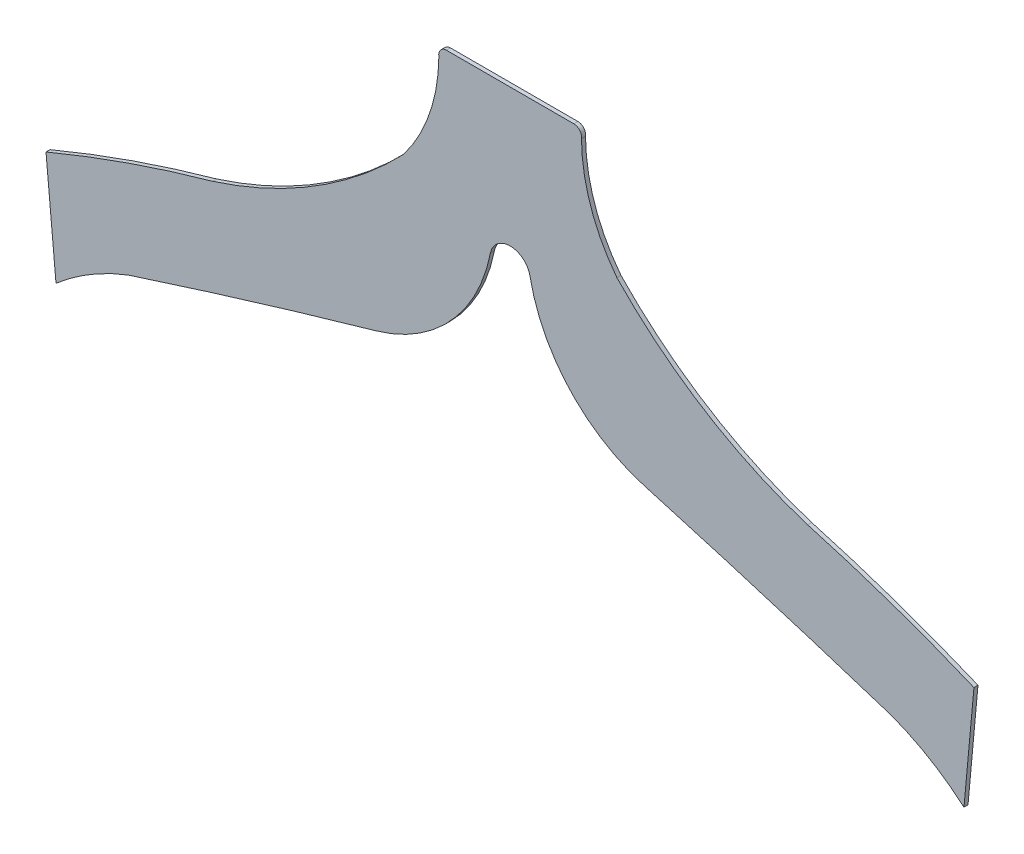
ISO-10303-21;
HEADER;
FILE_DESCRIPTION(('STEP AP214'),'2;1');
FILE_NAME('part.step','',(''),(''),'','','');
FILE_SCHEMA(('AUTOMOTIVE_DESIGN { 1 0 10303 214 1 1 1 1 }'));
ENDSEC;
DATA;
#1=APPLICATION_CONTEXT('core data for automotive mechanical design processes');
#2=APPLICATION_PROTOCOL_DEFINITION('international standard','automotive_design',2000,#1);
#3=PRODUCT_CONTEXT('',#1,'mechanical');
#4=PRODUCT('Part','Part','',(#3));
#5=PRODUCT_RELATED_PRODUCT_CATEGORY('part','',(#4));
#6=PRODUCT_DEFINITION_FORMATION('','',#4);
#7=PRODUCT_DEFINITION_CONTEXT('part definition',#1,'design');
#8=PRODUCT_DEFINITION('design','',#6,#7);
#9=PRODUCT_DEFINITION_SHAPE('','',#8);
#10=(LENGTH_UNIT() NAMED_UNIT(*) SI_UNIT(.MILLI.,.METRE.));
#11=(NAMED_UNIT(*) PLANE_ANGLE_UNIT() SI_UNIT($,.RADIAN.));
#12=(NAMED_UNIT(*) SI_UNIT($,.STERADIAN.) SOLID_ANGLE_UNIT());
#13=UNCERTAINTY_MEASURE_WITH_UNIT(LENGTH_MEASURE(1.E-05),#10,'distance_accuracy_value','');
#14=(GEOMETRIC_REPRESENTATION_CONTEXT(3) GLOBAL_UNCERTAINTY_ASSIGNED_CONTEXT((#13)) GLOBAL_UNIT_ASSIGNED_CONTEXT((#10,
#11,#12)) REPRESENTATION_CONTEXT('',''));
#15=CARTESIAN_POINT('',(0.,0.,0.));
#16=DIRECTION('',(0.,0.,1.));
#17=DIRECTION('',(1.,0.,0.));
#18=AXIS2_PLACEMENT_3D('',#15,#16,#17);
#19=CARTESIAN_POINT('',(-739.962312354849,864.313923100061,0.));
#20=DIRECTION('',(-0.995795754844476,-0.0916013899115097,0.));
#21=DIRECTION('',(0.0916013899115097,-0.995795754844476,0.));
#22=AXIS2_PLACEMENT_3D('',#19,#20,#21);
#23=PLANE('',#22);
#24=DIRECTION('',(0.0916013899115097,-0.995795754844476,0.));
#25=VECTOR('',#24,1.);
#26=CARTESIAN_POINT('',(-456.655661603026,-2215.50353829879,6.35));
#27=LINE('',#26,#25);
#28=CARTESIAN_POINT('',(-728.998263502241,745.124101702356,6.35));
#29=VERTEX_POINT('',#28);
#30=CARTESIAN_POINT('',(-713.283018643652,574.284181788008,6.35));
#31=VERTEX_POINT('',#30);
#32=EDGE_CURVE('E180',#29,#31,#27,.T.);
#33=ORIENTED_EDGE('',*,*,#32,.F.);
#34=DIRECTION('',(0.,0.,-1.));
#35=VECTOR('',#34,1.);
#36=CARTESIAN_POINT('',(-728.998263502241,745.124101702356,6.35));
#37=LINE('',#36,#35);
#38=CARTESIAN_POINT('',(-728.998263502241,745.124101702356,0.));
#39=VERTEX_POINT('',#38);
#40=EDGE_CURVE('E40',#29,#39,#37,.T.);
#41=ORIENTED_EDGE('',*,*,#40,.T.);
#42=DIRECTION('',(0.0916013899115097,-0.995795754844476,0.));
#43=VECTOR('',#42,1.);
#44=CARTESIAN_POINT('',(-456.655661603026,-2215.50353829879,0.));
#45=LINE('',#44,#43);
#46=CARTESIAN_POINT('',(-713.283018643652,574.284181788008,0.));
#47=VERTEX_POINT('',#46);
#48=EDGE_CURVE('E45',#39,#47,#45,.T.);
#49=ORIENTED_EDGE('',*,*,#48,.T.);
#50=DIRECTION('',(0.,0.,-1.));
#51=VECTOR('',#50,1.);
#52=CARTESIAN_POINT('',(-713.283018643652,574.284181788008,6.35));
#53=LINE('',#52,#51);
#54=EDGE_CURVE('E300',#31,#47,#53,.T.);
#55=ORIENTED_EDGE('',*,*,#54,.F.);
#56=EDGE_LOOP('',(#33,#41,#49,#55));
#57=FACE_BOUND('',#56,.T.);
#58=ADVANCED_FACE('F36',(#57),#23,.T.);
#59=CARTESIAN_POINT('',(739.962312354849,864.313923100061,0.));
#60=DIRECTION('',(0.995795754844476,-0.0916013899115097,0.));
#61=DIRECTION('',(-0.0916013899115097,-0.995795754844476,0.));
#62=AXIS2_PLACEMENT_3D('',#59,#60,#61);
#63=PLANE('',#62);
#64=DIRECTION('',(0.0916013899115097,0.995795754844476,0.));
#65=VECTOR('',#64,1.);
#66=CARTESIAN_POINT('',(453.174620911436,-2253.34581936543,0.));
#67=LINE('',#66,#65);
#68=CARTESIAN_POINT('',(713.326960600996,574.761873388814,0.));
#69=VERTEX_POINT('',#68);
#70=CARTESIAN_POINT('',(729.020382278945,745.364554210394,0.));
#71=VERTEX_POINT('',#70);
#72=EDGE_CURVE('E11',#69,#71,#67,.T.);
#73=ORIENTED_EDGE('',*,*,#72,.T.);
#74=DIRECTION('',(0.,0.,-1.));
#75=VECTOR('',#74,1.);
#76=CARTESIAN_POINT('',(729.020382278945,745.364554210394,6.35));
#77=LINE('',#76,#75);
#78=CARTESIAN_POINT('',(729.020382278945,745.364554210394,6.35));
#79=VERTEX_POINT('',#78);
#80=EDGE_CURVE('E301',#71,#79,#77,.F.);
#81=ORIENTED_EDGE('',*,*,#80,.T.);
#82=DIRECTION('',(0.0916013899115097,0.995795754844476,0.));
#83=VECTOR('',#82,1.);
#84=CARTESIAN_POINT('',(453.174620911436,-2253.34581936543,6.35));
#85=LINE('',#84,#83);
#86=CARTESIAN_POINT('',(713.326960600996,574.761873388814,6.35));
#87=VERTEX_POINT('',#86);
#88=EDGE_CURVE('E283',#87,#79,#85,.T.);
#89=ORIENTED_EDGE('',*,*,#88,.F.);
#90=DIRECTION('',(0.,0.,-1.));
#91=VECTOR('',#90,1.);
#92=CARTESIAN_POINT('',(713.326960600996,574.761873388813,6.35));
#93=LINE('',#92,#91);
#94=EDGE_CURVE('E298',#69,#87,#93,.F.);
#95=ORIENTED_EDGE('',*,*,#94,.F.);
#96=EDGE_LOOP('',(#73,#81,#89,#95));
#97=FACE_BOUND('',#96,.T.);
#98=ADVANCED_FACE('F38',(#97),#63,.T.);
#99=CARTESIAN_POINT('',(-464.236109922188,286.805130748695,6.35));
#100=DIRECTION('',(0.,0.,-1.));
#101=DIRECTION('',(-1.,0.,0.));
#102=AXIS2_PLACEMENT_3D('',#99,#100,#101);
#103=CYLINDRICAL_SURFACE('',#102,380.353214170961);
#104=CARTESIAN_POINT('',(-464.236109922188,286.805130748695,6.35));
#105=DIRECTION('',(0.,0.,1.));
#106=DIRECTION('',(1.,0.,0.));
#107=AXIS2_PLACEMENT_3D('',#104,#105,#106);
#108=CIRCLE('',#107,380.353214170961);
#109=CARTESIAN_POINT('',(-598.936998152931,642.507588204403,6.35));
#110=VERTEX_POINT('',#109);
#111=EDGE_CURVE('E168',#110,#31,#108,.T.);
#112=ORIENTED_EDGE('',*,*,#111,.T.);
#113=ORIENTED_EDGE('',*,*,#54,.T.);
#114=CARTESIAN_POINT('',(-464.236109922188,286.805130748695,0.));
#115=DIRECTION('',(0.,0.,1.));
#116=DIRECTION('',(1.,0.,0.));
#117=AXIS2_PLACEMENT_3D('',#114,#115,#116);
#118=CIRCLE('',#117,380.353214170961);
#119=CARTESIAN_POINT('',(-598.936998152931,642.507588204403,0.));
#120=VERTEX_POINT('',#119);
#121=EDGE_CURVE('E61',#120,#47,#118,.T.);
#122=ORIENTED_EDGE('',*,*,#121,.F.);
#123=DIRECTION('',(0.,0.,-1.));
#124=VECTOR('',#123,1.);
#125=CARTESIAN_POINT('',(-598.936998152931,642.507588204403,6.35));
#126=LINE('',#125,#124);
#127=EDGE_CURVE('E165',#110,#120,#126,.T.);
#128=ORIENTED_EDGE('',*,*,#127,.F.);
#129=EDGE_LOOP('',(#112,#113,#122,#128));
#130=FACE_BOUND('',#129,.T.);
#131=ADVANCED_FACE('F167',(#130),#103,.F.);
#132=CARTESIAN_POINT('',(2910.47635786436,-10166.0613568427,6.35));
#133=DIRECTION('',(0.,0.,-1.));
#134=DIRECTION('',(-1.,0.,0.));
#135=AXIS2_PLACEMENT_3D('',#132,#133,#134);
#136=CYLINDRICAL_SURFACE('',#135,11364.0285437528);
#137=CARTESIAN_POINT('',(2910.47635786436,-10166.0613568427,0.));
#138=DIRECTION('',(0.,0.,1.));
#139=DIRECTION('',(1.,0.,0.));
#140=AXIS2_PLACEMENT_3D('',#137,#138,#139);
#141=CIRCLE('',#140,11364.0285437528);
#142=CARTESIAN_POINT('',(-210.317049563548,761.051402316683,0.));
#143=VERTEX_POINT('',#142);
#144=EDGE_CURVE('E226',#143,#120,#141,.T.);
#145=ORIENTED_EDGE('',*,*,#144,.F.);
#146=DIRECTION('',(0.,0.,-1.));
#147=VECTOR('',#146,1.);
#148=CARTESIAN_POINT('',(-210.317049563548,761.051402316683,6.35));
#149=LINE('',#148,#147);
#150=CARTESIAN_POINT('',(-210.317049563548,761.051402316683,6.35));
#151=VERTEX_POINT('',#150);
#152=EDGE_CURVE('E173',#151,#143,#149,.T.);
#153=ORIENTED_EDGE('',*,*,#152,.F.);
#154=CARTESIAN_POINT('',(2910.47635786436,-10166.0613568427,6.35));
#155=DIRECTION('',(0.,0.,1.));
#156=DIRECTION('',(1.,0.,0.));
#157=AXIS2_PLACEMENT_3D('',#154,#155,#156);
#158=CIRCLE('',#157,11364.0285437528);
#159=EDGE_CURVE('E179',#151,#110,#158,.T.);
#160=ORIENTED_EDGE('',*,*,#159,.T.);
#161=ORIENTED_EDGE('',*,*,#127,.T.);
#162=EDGE_LOOP('',(#145,#153,#160,#161));
#163=FACE_BOUND('',#162,.T.);
#164=ADVANCED_FACE('F184',(#163),#136,.F.);
#165=CARTESIAN_POINT('',(-280.070616472063,1005.28579773129,6.35));
#166=DIRECTION('',(0.,0.,-1.));
#167=DIRECTION('',(-1.,0.,0.));
#168=AXIS2_PLACEMENT_3D('',#165,#166,#167);
#169=CYLINDRICAL_SURFACE('',#168,254.000000000009);
#170=CARTESIAN_POINT('',(-280.070616472063,1005.28579773129,0.));
#171=DIRECTION('',(0.,0.,1.));
#172=DIRECTION('',(1.,0.,0.));
#173=AXIS2_PLACEMENT_3D('',#170,#171,#172);
#174=CIRCLE('',#173,254.000000000009);
#175=CARTESIAN_POINT('',(-30.8538816694499,956.22441684638,0.));
#176=VERTEX_POINT('',#175);
#177=EDGE_CURVE('E228',#143,#176,#174,.T.);
#178=ORIENTED_EDGE('',*,*,#177,.T.);
#179=DIRECTION('',(0.,0.,-1.));
#180=VECTOR('',#179,1.);
#181=CARTESIAN_POINT('',(-30.8538816694499,956.22441684638,6.35));
#182=LINE('',#181,#180);
#183=CARTESIAN_POINT('',(-30.8538816694499,956.22441684638,6.35));
#184=VERTEX_POINT('',#183);
#185=EDGE_CURVE('E289',#184,#176,#182,.T.);
#186=ORIENTED_EDGE('',*,*,#185,.F.);
#187=CARTESIAN_POINT('',(-280.070616472063,1005.28579773129,6.35));
#188=DIRECTION('',(0.,0.,1.));
#189=DIRECTION('',(1.,0.,0.));
#190=AXIS2_PLACEMENT_3D('',#187,#188,#189);
#191=CIRCLE('',#190,254.000000000009);
#192=EDGE_CURVE('E186',#151,#184,#191,.T.);
#193=ORIENTED_EDGE('',*,*,#192,.F.);
#194=ORIENTED_EDGE('',*,*,#152,.T.);
#195=EDGE_LOOP('',(#178,#186,#193,#194));
#196=FACE_BOUND('',#195,.T.);
#197=ADVANCED_FACE('F362',(#196),#169,.T.);
#198=CARTESIAN_POINT('',(0.298210181109315,950.091744235703,6.35));
#199=DIRECTION('',(0.,0.,-1.));
#200=DIRECTION('',(-1.,0.,0.));
#201=AXIS2_PLACEMENT_3D('',#198,#199,#200);
#202=CYLINDRICAL_SURFACE('',#201,31.7500000002431);
#203=CARTESIAN_POINT('',(0.298210181109315,950.091744235703,0.));
#204=DIRECTION('',(0.,0.,1.));
#205=DIRECTION('',(1.,0.,0.));
#206=AXIS2_PLACEMENT_3D('',#203,#204,#205);
#207=CIRCLE('',#206,31.7500000002431);
#208=CARTESIAN_POINT('',(31.4503020317647,956.224416846365,0.));
#209=VERTEX_POINT('',#208);
#210=EDGE_CURVE('E231',#209,#176,#207,.T.);
#211=ORIENTED_EDGE('',*,*,#210,.F.);
#212=DIRECTION('',(0.,0.,-1.));
#213=VECTOR('',#212,1.);
#214=CARTESIAN_POINT('',(31.4503020317647,956.224416846365,6.35));
#215=LINE('',#214,#213);
#216=CARTESIAN_POINT('',(31.4503020317647,956.224416846365,6.35));
#217=VERTEX_POINT('',#216);
#218=EDGE_CURVE('E287',#217,#209,#215,.T.);
#219=ORIENTED_EDGE('',*,*,#218,.F.);
#220=CARTESIAN_POINT('',(0.298210181109315,950.091744235703,6.35));
#221=DIRECTION('',(0.,0.,1.));
#222=DIRECTION('',(1.,0.,0.));
#223=AXIS2_PLACEMENT_3D('',#220,#221,#222);
#224=CIRCLE('',#223,31.7500000002431);
#225=EDGE_CURVE('E188',#217,#184,#224,.T.);
#226=ORIENTED_EDGE('',*,*,#225,.T.);
#227=ORIENTED_EDGE('',*,*,#185,.T.);
#228=EDGE_LOOP('',(#211,#219,#226,#227));
#229=FACE_BOUND('',#228,.T.);
#230=ADVANCED_FACE('F359',(#229),#202,.F.);
#231=CARTESIAN_POINT('',(280.667036834467,1005.28579773129,6.35));
#232=DIRECTION('',(0.,0.,-1.));
#233=DIRECTION('',(-1.,0.,0.));
#234=AXIS2_PLACEMENT_3D('',#231,#232,#233);
#235=CYLINDRICAL_SURFACE('',#234,254.000000000009);
#236=CARTESIAN_POINT('',(280.667036834467,1005.28579773129,0.));
#237=DIRECTION('',(0.,0.,1.));
#238=DIRECTION('',(1.,0.,0.));
#239=AXIS2_PLACEMENT_3D('',#236,#237,#238);
#240=CIRCLE('',#239,254.000000000009);
#241=CARTESIAN_POINT('',(210.913469904233,761.051402322885,0.));
#242=VERTEX_POINT('',#241);
#243=EDGE_CURVE('E234',#209,#242,#240,.T.);
#244=ORIENTED_EDGE('',*,*,#243,.T.);
#245=DIRECTION('',(0.,0.,-1.));
#246=VECTOR('',#245,1.);
#247=CARTESIAN_POINT('',(210.913469904233,761.051402322885,6.35));
#248=LINE('',#247,#246);
#249=CARTESIAN_POINT('',(210.913469904233,761.051402322885,6.35));
#250=VERTEX_POINT('',#249);
#251=EDGE_CURVE('E285',#250,#242,#248,.T.);
#252=ORIENTED_EDGE('',*,*,#251,.F.);
#253=CARTESIAN_POINT('',(280.667036834467,1005.28579773129,6.35));
#254=DIRECTION('',(0.,0.,1.));
#255=DIRECTION('',(1.,0.,0.));
#256=AXIS2_PLACEMENT_3D('',#253,#254,#255);
#257=CIRCLE('',#256,254.000000000009);
#258=EDGE_CURVE('E193',#217,#250,#257,.T.);
#259=ORIENTED_EDGE('',*,*,#258,.F.);
#260=ORIENTED_EDGE('',*,*,#218,.T.);
#261=EDGE_LOOP('',(#244,#252,#259,#260));
#262=FACE_BOUND('',#261,.T.);
#263=ADVANCED_FACE('F371',(#262),#235,.T.);
#264=CARTESIAN_POINT('',(-2909.87993750195,-10166.0613568427,6.35));
#265=DIRECTION('',(0.,0.,-1.));
#266=DIRECTION('',(-1.,0.,0.));
#267=AXIS2_PLACEMENT_3D('',#264,#265,#266);
#268=CYLINDRICAL_SURFACE('',#267,11364.0285437528);
#269=CARTESIAN_POINT('',(-2909.87993750195,-10166.0613568427,0.));
#270=DIRECTION('',(0.,0.,1.));
#271=DIRECTION('',(1.,0.,0.));
#272=AXIS2_PLACEMENT_3D('',#269,#270,#271);
#273=CIRCLE('',#272,11364.0285437528);
#274=CARTESIAN_POINT('',(599.533418515338,642.507588204403,0.));
#275=VERTEX_POINT('',#274);
#276=EDGE_CURVE('E237',#275,#242,#273,.T.);
#277=ORIENTED_EDGE('',*,*,#276,.F.);
#278=DIRECTION('',(0.,0.,-1.));
#279=VECTOR('',#278,1.);
#280=CARTESIAN_POINT('',(599.533418515338,642.507588204403,6.35));
#281=LINE('',#280,#279);
#282=CARTESIAN_POINT('',(599.533418515338,642.507588204403,6.35));
#283=VERTEX_POINT('',#282);
#284=EDGE_CURVE('E224',#283,#275,#281,.T.);
#285=ORIENTED_EDGE('',*,*,#284,.F.);
#286=CARTESIAN_POINT('',(-2909.87993750195,-10166.0613568427,6.35));
#287=DIRECTION('',(0.,0.,1.));
#288=DIRECTION('',(1.,0.,0.));
#289=AXIS2_PLACEMENT_3D('',#286,#287,#288);
#290=CIRCLE('',#289,11364.0285437528);
#291=EDGE_CURVE('E195',#283,#250,#290,.T.);
#292=ORIENTED_EDGE('',*,*,#291,.T.);
#293=ORIENTED_EDGE('',*,*,#251,.T.);
#294=EDGE_LOOP('',(#277,#285,#292,#293));
#295=FACE_BOUND('',#294,.T.);
#296=ADVANCED_FACE('F353',(#295),#268,.F.);
#297=CARTESIAN_POINT('',(464.83253028459,286.805130748693,6.35));
#298=DIRECTION('',(0.,0.,-1.));
#299=DIRECTION('',(-1.,0.,0.));
#300=AXIS2_PLACEMENT_3D('',#297,#298,#299);
#301=CYLINDRICAL_SURFACE('',#300,380.353214170964);
#302=CARTESIAN_POINT('',(464.83253028459,286.805130748693,0.));
#303=DIRECTION('',(0.,0.,1.));
#304=DIRECTION('',(1.,0.,0.));
#305=AXIS2_PLACEMENT_3D('',#302,#303,#304);
#306=CIRCLE('',#305,380.353214170964);
#307=EDGE_CURVE('E53',#69,#275,#306,.T.);
#308=ORIENTED_EDGE('',*,*,#307,.F.);
#309=ORIENTED_EDGE('',*,*,#94,.T.);
#310=CARTESIAN_POINT('',(464.83253028459,286.805130748693,6.35));
#311=DIRECTION('',(0.,0.,1.));
#312=DIRECTION('',(1.,0.,0.));
#313=AXIS2_PLACEMENT_3D('',#310,#311,#312);
#314=CIRCLE('',#313,380.353214170964);
#315=EDGE_CURVE('E198',#87,#283,#314,.T.);
#316=ORIENTED_EDGE('',*,*,#315,.T.);
#317=ORIENTED_EDGE('',*,*,#284,.T.);
#318=EDGE_LOOP('',(#308,#309,#316,#317));
#319=FACE_BOUND('',#318,.T.);
#320=ADVANCED_FACE('F345',(#319),#301,.F.);
#321=CARTESIAN_POINT('',(-132.728995937928,-1313.66098101385,6.35));
#322=DIRECTION('',(0.,0.,-1.));
#323=DIRECTION('',(-1.,0.,0.));
#324=AXIS2_PLACEMENT_3D('',#321,#322,#323);
#325=CYLINDRICAL_SURFACE('',#324,2232.08381239653);
#326=ORIENTED_EDGE('',*,*,#80,.F.);
#327=CARTESIAN_POINT('',(-132.728995937928,-1313.66098101385,0.));
#328=DIRECTION('',(0.,0.,1.));
#329=DIRECTION('',(1.,0.,0.));
#330=AXIS2_PLACEMENT_3D('',#327,#328,#329);
#331=CIRCLE('',#330,2232.08381239653);
#332=CARTESIAN_POINT('',(467.685955529307,836.152971777706,0.));
#333=VERTEX_POINT('',#332);
#334=EDGE_CURVE('E241',#71,#333,#331,.T.);
#335=ORIENTED_EDGE('',*,*,#334,.T.);
#336=DIRECTION('',(0.,0.,-1.));
#337=VECTOR('',#336,1.);
#338=CARTESIAN_POINT('',(467.685955529307,836.152971777706,6.35));
#339=LINE('',#338,#337);
#340=CARTESIAN_POINT('',(467.685955529307,836.152971777706,6.35));
#341=VERTEX_POINT('',#340);
#342=EDGE_CURVE('E280',#341,#333,#339,.T.);
#343=ORIENTED_EDGE('',*,*,#342,.F.);
#344=CARTESIAN_POINT('',(-132.728995937928,-1313.66098101385,6.35));
#345=DIRECTION('',(0.,0.,1.));
#346=DIRECTION('',(1.,0.,0.));
#347=AXIS2_PLACEMENT_3D('',#344,#345,#346);
#348=CIRCLE('',#347,2232.08381239653);
#349=EDGE_CURVE('E200',#79,#341,#348,.T.);
#350=ORIENTED_EDGE('',*,*,#349,.F.);
#351=EDGE_LOOP('',(#326,#335,#343,#350));
#352=FACE_BOUND('',#351,.T.);
#353=ADVANCED_FACE('F342',(#352),#325,.T.);
#354=CARTESIAN_POINT('',(683.789534639859,1517.62665916351,6.35));
#355=DIRECTION('',(0.,0.,-1.));
#356=DIRECTION('',(-1.,0.,0.));
#357=AXIS2_PLACEMENT_3D('',#354,#355,#356);
#358=CYLINDRICAL_SURFACE('',#357,714.917578119043);
#359=CARTESIAN_POINT('',(683.789534639859,1517.62665916351,0.));
#360=DIRECTION('',(0.,0.,1.));
#361=DIRECTION('',(1.,0.,0.));
#362=AXIS2_PLACEMENT_3D('',#359,#360,#361);
#363=CIRCLE('',#362,714.917578119043);
#364=CARTESIAN_POINT('',(168.209342452343,1022.36490117337,0.));
#365=VERTEX_POINT('',#364);
#366=EDGE_CURVE('E243',#365,#333,#363,.T.);
#367=ORIENTED_EDGE('',*,*,#366,.F.);
#368=DIRECTION('',(0.,0.,-1.));
#369=VECTOR('',#368,1.);
#370=CARTESIAN_POINT('',(168.209342452343,1022.36490117337,6.35));
#371=LINE('',#370,#369);
#372=CARTESIAN_POINT('',(168.209342452343,1022.36490117337,6.35));
#373=VERTEX_POINT('',#372);
#374=EDGE_CURVE('E278',#373,#365,#371,.T.);
#375=ORIENTED_EDGE('',*,*,#374,.F.);
#376=CARTESIAN_POINT('',(683.789534639859,1517.62665916351,6.35));
#377=DIRECTION('',(0.,0.,1.));
#378=DIRECTION('',(1.,0.,0.));
#379=AXIS2_PLACEMENT_3D('',#376,#377,#378);
#380=CIRCLE('',#379,714.917578119043);
#381=EDGE_CURVE('E202',#373,#341,#380,.T.);
#382=ORIENTED_EDGE('',*,*,#381,.T.);
#383=ORIENTED_EDGE('',*,*,#342,.T.);
#384=EDGE_LOOP('',(#367,#375,#382,#383));
#385=FACE_BOUND('',#384,.T.);
#386=ADVANCED_FACE('F336',(#385),#358,.F.);
#387=CARTESIAN_POINT('',(378.612449941224,1185.60299501999,6.35));
#388=DIRECTION('',(0.,0.,-1.));
#389=DIRECTION('',(-1.,0.,0.));
#390=AXIS2_PLACEMENT_3D('',#387,#388,#389);
#391=CYLINDRICAL_SURFACE('',#390,266.300850399798);
#392=CARTESIAN_POINT('',(378.612449941224,1185.60299501999,0.));
#393=DIRECTION('',(0.,0.,1.));
#394=DIRECTION('',(1.,0.,0.));
#395=AXIS2_PLACEMENT_3D('',#392,#393,#394);
#396=CIRCLE('',#395,266.300850399798);
#397=CARTESIAN_POINT('',(112.317919373796,1183.76835240394,0.));
#398=VERTEX_POINT('',#397);
#399=EDGE_CURVE('E246',#398,#365,#396,.T.);
#400=ORIENTED_EDGE('',*,*,#399,.F.);
#401=DIRECTION('',(0.,0.,-1.));
#402=VECTOR('',#401,1.);
#403=CARTESIAN_POINT('',(112.317919373796,1183.76835240394,6.35));
#404=LINE('',#403,#402);
#405=CARTESIAN_POINT('',(112.317919373796,1183.76835240394,6.35));
#406=VERTEX_POINT('',#405);
#407=EDGE_CURVE('E276',#406,#398,#404,.T.);
#408=ORIENTED_EDGE('',*,*,#407,.F.);
#409=CARTESIAN_POINT('',(378.612449941224,1185.60299501999,6.35));
#410=DIRECTION('',(0.,0.,1.));
#411=DIRECTION('',(1.,0.,0.));
#412=AXIS2_PLACEMENT_3D('',#409,#410,#411);
#413=CIRCLE('',#412,266.300850399798);
#414=EDGE_CURVE('E205',#406,#373,#413,.T.);
#415=ORIENTED_EDGE('',*,*,#414,.T.);
#416=ORIENTED_EDGE('',*,*,#374,.T.);
#417=EDGE_LOOP('',(#400,#408,#415,#416));
#418=FACE_BOUND('',#417,.T.);
#419=ADVANCED_FACE('F331',(#418),#391,.F.);
#420=CARTESIAN_POINT('',(100.39823369727,1186.00587697915,6.35));
#421=DIRECTION('',(0.,0.,-1.));
#422=DIRECTION('',(-1.,0.,0.));
#423=AXIS2_PLACEMENT_3D('',#420,#421,#422);
#424=CYLINDRICAL_SURFACE('',#423,12.1278779203871);
#425=CARTESIAN_POINT('',(100.39823369727,1186.00587697915,0.));
#426=DIRECTION('',(0.,0.,1.));
#427=DIRECTION('',(1.,0.,0.));
#428=AXIS2_PLACEMENT_3D('',#425,#426,#427);
#429=CIRCLE('',#428,12.1278779203871);
#430=CARTESIAN_POINT('',(100.398233697268,1198.13375489953,0.));
#431=VERTEX_POINT('',#430);
#432=EDGE_CURVE('E249',#398,#431,#429,.T.);
#433=ORIENTED_EDGE('',*,*,#432,.T.);
#434=DIRECTION('',(0.,0.,-1.));
#435=VECTOR('',#434,1.);
#436=CARTESIAN_POINT('',(100.398233697268,1198.13375489953,6.35));
#437=LINE('',#436,#435);
#438=CARTESIAN_POINT('',(100.398233697268,1198.13375489953,6.35));
#439=VERTEX_POINT('',#438);
#440=EDGE_CURVE('E273',#439,#431,#437,.T.);
#441=ORIENTED_EDGE('',*,*,#440,.F.);
#442=CARTESIAN_POINT('',(100.39823369727,1186.00587697915,6.35));
#443=DIRECTION('',(0.,0.,1.));
#444=DIRECTION('',(1.,0.,0.));
#445=AXIS2_PLACEMENT_3D('',#442,#443,#444);
#446=CIRCLE('',#445,12.1278779203871);
#447=EDGE_CURVE('E208',#406,#439,#446,.T.);
#448=ORIENTED_EDGE('',*,*,#447,.F.);
#449=ORIENTED_EDGE('',*,*,#407,.T.);
#450=EDGE_LOOP('',(#433,#441,#448,#449));
#451=FACE_BOUND('',#450,.T.);
#452=ADVANCED_FACE('F328',(#451),#424,.T.);
#453=CARTESIAN_POINT('',(-207.431628724042,1198.13375489954,6.35));
#454=DIRECTION('',(0.,-1.,0.));
#455=DIRECTION('',(1.,0.,0.));
#456=AXIS2_PLACEMENT_3D('',#453,#454,#455);
#457=PLANE('',#456);
#458=DIRECTION('',(-1.,0.,0.));
#459=VECTOR('',#458,1.);
#460=CARTESIAN_POINT('',(-207.431628724042,1198.13375489954,0.));
#461=LINE('',#460,#459);
#462=CARTESIAN_POINT('',(-99.8018133351288,1198.13375489953,0.));
#463=VERTEX_POINT('',#462);
#464=EDGE_CURVE('E252',#431,#463,#461,.T.);
#465=ORIENTED_EDGE('',*,*,#464,.T.);
#466=DIRECTION('',(0.,0.,-1.));
#467=VECTOR('',#466,1.);
#468=CARTESIAN_POINT('',(-99.8018133351288,1198.13375489953,6.35));
#469=LINE('',#468,#467);
#470=CARTESIAN_POINT('',(-99.8018133351288,1198.13375489953,6.35));
#471=VERTEX_POINT('',#470);
#472=EDGE_CURVE('E270',#471,#463,#469,.T.);
#473=ORIENTED_EDGE('',*,*,#472,.F.);
#474=DIRECTION('',(-1.,0.,0.));
#475=VECTOR('',#474,1.);
#476=CARTESIAN_POINT('',(-207.431628724042,1198.13375489954,6.35));
#477=LINE('',#476,#475);
#478=EDGE_CURVE('E211',#439,#471,#477,.T.);
#479=ORIENTED_EDGE('',*,*,#478,.F.);
#480=ORIENTED_EDGE('',*,*,#440,.T.);
#481=EDGE_LOOP('',(#465,#473,#479,#480));
#482=FACE_BOUND('',#481,.T.);
#483=ADVANCED_FACE('F324',(#482),#457,.F.);
#484=CARTESIAN_POINT('',(-99.8018133351275,1186.00587697915,6.35));
#485=DIRECTION('',(0.,0.,-1.));
#486=DIRECTION('',(-1.,0.,0.));
#487=AXIS2_PLACEMENT_3D('',#484,#485,#486);
#488=CYLINDRICAL_SURFACE('',#487,12.1278779203877);
#489=CARTESIAN_POINT('',(-99.8018133351275,1186.00587697915,0.));
#490=DIRECTION('',(0.,0.,1.));
#491=DIRECTION('',(1.,0.,0.));
#492=AXIS2_PLACEMENT_3D('',#489,#490,#491);
#493=CIRCLE('',#492,12.1278779203877);
#494=CARTESIAN_POINT('',(-111.721499011654,1183.76835240395,0.));
#495=VERTEX_POINT('',#494);
#496=EDGE_CURVE('E255',#463,#495,#493,.T.);
#497=ORIENTED_EDGE('',*,*,#496,.T.);
#498=DIRECTION('',(0.,0.,-1.));
#499=VECTOR('',#498,1.);
#500=CARTESIAN_POINT('',(-111.721499011654,1183.76835240395,6.35));
#501=LINE('',#500,#499);
#502=CARTESIAN_POINT('',(-111.721499011654,1183.76835240395,6.35));
#503=VERTEX_POINT('',#502);
#504=EDGE_CURVE('E268',#503,#495,#501,.T.);
#505=ORIENTED_EDGE('',*,*,#504,.F.);
#506=CARTESIAN_POINT('',(-99.8018133351275,1186.00587697915,6.35));
#507=DIRECTION('',(0.,0.,1.));
#508=DIRECTION('',(1.,0.,0.));
#509=AXIS2_PLACEMENT_3D('',#506,#507,#508);
#510=CIRCLE('',#509,12.1278779203877);
#511=EDGE_CURVE('E214',#471,#503,#510,.T.);
#512=ORIENTED_EDGE('',*,*,#511,.F.);
#513=ORIENTED_EDGE('',*,*,#472,.T.);
#514=EDGE_LOOP('',(#497,#505,#512,#513));
#515=FACE_BOUND('',#514,.T.);
#516=ADVANCED_FACE('F322',(#515),#488,.T.);
#517=CARTESIAN_POINT('',(-378.016029579083,1185.60299501999,6.35));
#518=DIRECTION('',(0.,0.,-1.));
#519=DIRECTION('',(-1.,0.,0.));
#520=AXIS2_PLACEMENT_3D('',#517,#518,#519);
#521=CYLINDRICAL_SURFACE('',#520,266.300850399797);
#522=CARTESIAN_POINT('',(-378.016029579083,1185.60299501999,0.));
#523=DIRECTION('',(0.,0.,1.));
#524=DIRECTION('',(1.,0.,0.));
#525=AXIS2_PLACEMENT_3D('',#522,#523,#524);
#526=CIRCLE('',#525,266.300850399797);
#527=CARTESIAN_POINT('',(-167.612922090318,1022.36490117322,0.));
#528=VERTEX_POINT('',#527);
#529=EDGE_CURVE('E258',#528,#495,#526,.T.);
#530=ORIENTED_EDGE('',*,*,#529,.F.);
#531=DIRECTION('',(0.,0.,-1.));
#532=VECTOR('',#531,1.);
#533=CARTESIAN_POINT('',(-167.612922090318,1022.36490117322,6.35));
#534=LINE('',#533,#532);
#535=CARTESIAN_POINT('',(-167.612922090318,1022.36490117322,6.35));
#536=VERTEX_POINT('',#535);
#537=EDGE_CURVE('E266',#536,#528,#534,.T.);
#538=ORIENTED_EDGE('',*,*,#537,.F.);
#539=CARTESIAN_POINT('',(-378.016029579083,1185.60299501999,6.35));
#540=DIRECTION('',(0.,0.,1.));
#541=DIRECTION('',(1.,0.,0.));
#542=AXIS2_PLACEMENT_3D('',#539,#540,#541);
#543=CIRCLE('',#542,266.300850399797);
#544=EDGE_CURVE('E216',#536,#503,#543,.T.);
#545=ORIENTED_EDGE('',*,*,#544,.T.);
#546=ORIENTED_EDGE('',*,*,#504,.T.);
#547=EDGE_LOOP('',(#530,#538,#545,#546));
#548=FACE_BOUND('',#547,.T.);
#549=ADVANCED_FACE('F317',(#548),#521,.F.);
#550=CARTESIAN_POINT('',(-683.193114277703,1517.6266591635,6.35));
#551=DIRECTION('',(0.,0.,-1.));
#552=DIRECTION('',(-1.,0.,0.));
#553=AXIS2_PLACEMENT_3D('',#550,#551,#552);
#554=CYLINDRICAL_SURFACE('',#553,714.917578119042);
#555=CARTESIAN_POINT('',(-683.193114277703,1517.6266591635,0.));
#556=DIRECTION('',(0.,0.,1.));
#557=DIRECTION('',(1.,0.,0.));
#558=AXIS2_PLACEMENT_3D('',#555,#556,#557);
#559=CIRCLE('',#558,714.917578119042);
#560=CARTESIAN_POINT('',(-467.089535167148,836.152971777693,0.));
#561=VERTEX_POINT('',#560);
#562=EDGE_CURVE('E261',#561,#528,#559,.T.);
#563=ORIENTED_EDGE('',*,*,#562,.F.);
#564=DIRECTION('',(0.,0.,-1.));
#565=VECTOR('',#564,1.);
#566=CARTESIAN_POINT('',(-467.089535167148,836.152971777693,6.35));
#567=LINE('',#566,#565);
#568=CARTESIAN_POINT('',(-467.089535167148,836.152971777693,6.35));
#569=VERTEX_POINT('',#568);
#570=EDGE_CURVE('E172',#569,#561,#567,.T.);
#571=ORIENTED_EDGE('',*,*,#570,.F.);
#572=CARTESIAN_POINT('',(-683.193114277703,1517.6266591635,6.35));
#573=DIRECTION('',(0.,0.,1.));
#574=DIRECTION('',(1.,0.,0.));
#575=AXIS2_PLACEMENT_3D('',#572,#573,#574);
#576=CIRCLE('',#575,714.917578119042);
#577=EDGE_CURVE('E219',#569,#536,#576,.T.);
#578=ORIENTED_EDGE('',*,*,#577,.T.);
#579=ORIENTED_EDGE('',*,*,#537,.T.);
#580=EDGE_LOOP('',(#563,#571,#578,#579));
#581=FACE_BOUND('',#580,.T.);
#582=ADVANCED_FACE('F311',(#581),#554,.F.);
#583=CARTESIAN_POINT('',(133.325416300086,-1313.66098101386,6.35));
#584=DIRECTION('',(0.,0.,-1.));
#585=DIRECTION('',(-1.,0.,0.));
#586=AXIS2_PLACEMENT_3D('',#583,#584,#585);
#587=CYLINDRICAL_SURFACE('',#586,2232.08381239653);
#588=ORIENTED_EDGE('',*,*,#40,.F.);
#589=CARTESIAN_POINT('',(133.325416300086,-1313.66098101386,6.35));
#590=DIRECTION('',(0.,0.,1.));
#591=DIRECTION('',(1.,0.,0.));
#592=AXIS2_PLACEMENT_3D('',#589,#590,#591);
#593=CIRCLE('',#592,2232.08381239653);
#594=EDGE_CURVE('E222',#569,#29,#593,.T.);
#595=ORIENTED_EDGE('',*,*,#594,.F.);
#596=ORIENTED_EDGE('',*,*,#570,.T.);
#597=CARTESIAN_POINT('',(133.325416300086,-1313.66098101386,0.));
#598=DIRECTION('',(0.,0.,1.));
#599=DIRECTION('',(1.,0.,0.));
#600=AXIS2_PLACEMENT_3D('',#597,#598,#599);
#601=CIRCLE('',#600,2232.08381239653);
#602=EDGE_CURVE('E182',#561,#39,#601,.T.);
#603=ORIENTED_EDGE('',*,*,#602,.T.);
#604=EDGE_LOOP('',(#588,#595,#596,#603));
#605=FACE_BOUND('',#604,.T.);
#606=ADVANCED_FACE('F405',(#605),#587,.T.);
#607=CARTESIAN_POINT('',(-207.431628724102,-2192.57788542269,0.));
#608=DIRECTION('',(0.,0.,1.));
#609=DIRECTION('',(1.,0.,0.));
#610=AXIS2_PLACEMENT_3D('',#607,#608,#609);
#611=PLANE('',#610);
#612=ORIENTED_EDGE('',*,*,#48,.F.);
#613=ORIENTED_EDGE('',*,*,#602,.F.);
#614=ORIENTED_EDGE('',*,*,#562,.T.);
#615=ORIENTED_EDGE('',*,*,#529,.T.);
#616=ORIENTED_EDGE('',*,*,#496,.F.);
#617=ORIENTED_EDGE('',*,*,#464,.F.);
#618=ORIENTED_EDGE('',*,*,#432,.F.);
#619=ORIENTED_EDGE('',*,*,#399,.T.);
#620=ORIENTED_EDGE('',*,*,#366,.T.);
#621=ORIENTED_EDGE('',*,*,#334,.F.);
#622=ORIENTED_EDGE('',*,*,#72,.F.);
#623=ORIENTED_EDGE('',*,*,#307,.T.);
#624=ORIENTED_EDGE('',*,*,#276,.T.);
#625=ORIENTED_EDGE('',*,*,#243,.F.);
#626=ORIENTED_EDGE('',*,*,#210,.T.);
#627=ORIENTED_EDGE('',*,*,#177,.F.);
#628=ORIENTED_EDGE('',*,*,#144,.T.);
#629=ORIENTED_EDGE('',*,*,#121,.T.);
#630=EDGE_LOOP('',(#612,#613,#614,#615,#616,#617,#618,#619,#620,#621,#622,#623,#624,#625,#626,
#627,#628,#629));
#631=FACE_BOUND('',#630,.T.);
#632=ADVANCED_FACE('F307',(#631),#611,.F.);
#633=CARTESIAN_POINT('',(-207.431628724102,-2192.57788542269,6.35));
#634=DIRECTION('',(0.,0.,1.));
#635=DIRECTION('',(1.,0.,0.));
#636=AXIS2_PLACEMENT_3D('',#633,#634,#635);
#637=PLANE('',#636);
#638=ORIENTED_EDGE('',*,*,#594,.T.);
#639=ORIENTED_EDGE('',*,*,#32,.T.);
#640=ORIENTED_EDGE('',*,*,#111,.F.);
#641=ORIENTED_EDGE('',*,*,#159,.F.);
#642=ORIENTED_EDGE('',*,*,#192,.T.);
#643=ORIENTED_EDGE('',*,*,#225,.F.);
#644=ORIENTED_EDGE('',*,*,#258,.T.);
#645=ORIENTED_EDGE('',*,*,#291,.F.);
#646=ORIENTED_EDGE('',*,*,#315,.F.);
#647=ORIENTED_EDGE('',*,*,#88,.T.);
#648=ORIENTED_EDGE('',*,*,#349,.T.);
#649=ORIENTED_EDGE('',*,*,#381,.F.);
#650=ORIENTED_EDGE('',*,*,#414,.F.);
#651=ORIENTED_EDGE('',*,*,#447,.T.);
#652=ORIENTED_EDGE('',*,*,#478,.T.);
#653=ORIENTED_EDGE('',*,*,#511,.T.);
#654=ORIENTED_EDGE('',*,*,#544,.F.);
#655=ORIENTED_EDGE('',*,*,#577,.F.);
#656=EDGE_LOOP('',(#638,#639,#640,#641,#642,#643,#644,#645,#646,#647,#648,#649,#650,#651,#652,
#653,#654,#655));
#657=FACE_BOUND('',#656,.T.);
#658=ADVANCED_FACE('F178',(#657),#637,.T.);
#659=CLOSED_SHELL('',(#58,#98,#131,#164,#197,#230,#263,#296,#320,#353,#386,#419,#452,#483,#516,
#549,#582,#606,#632,#658));
#660=MANIFOLD_SOLID_BREP('B2',#659);
#661=ADVANCED_BREP_SHAPE_REPRESENTATION('',(#18,#660),#14);
#662=SHAPE_DEFINITION_REPRESENTATION(#9,#661);
ENDSEC;
END-ISO-10303-21;
